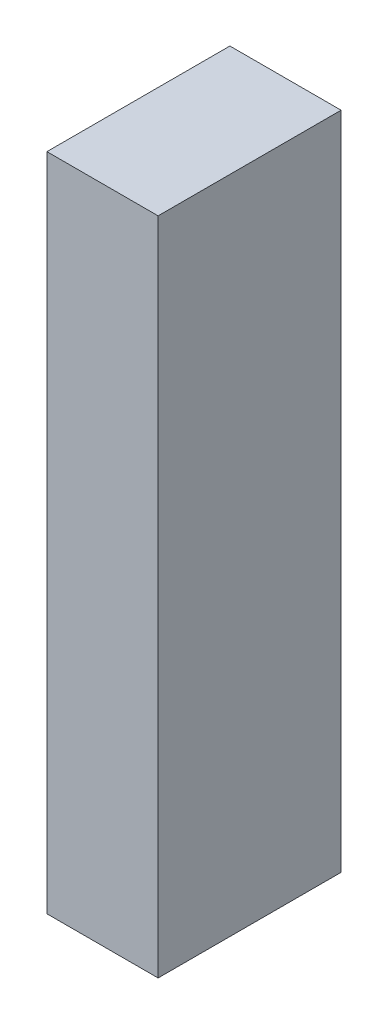
ISO-10303-21;
HEADER;
FILE_DESCRIPTION(('STEP AP214'),'2;1');
FILE_NAME('part.step','',(''),(''),'','','');
FILE_SCHEMA(('AUTOMOTIVE_DESIGN { 1 0 10303 214 1 1 1 1 }'));
ENDSEC;
DATA;
#1=APPLICATION_CONTEXT('core data for automotive mechanical design processes');
#2=APPLICATION_PROTOCOL_DEFINITION('international standard','automotive_design',2000,#1);
#3=PRODUCT_CONTEXT('',#1,'mechanical');
#4=PRODUCT('Part','Part','',(#3));
#5=PRODUCT_RELATED_PRODUCT_CATEGORY('part','',(#4));
#6=PRODUCT_DEFINITION_FORMATION('','',#4);
#7=PRODUCT_DEFINITION_CONTEXT('part definition',#1,'design');
#8=PRODUCT_DEFINITION('design','',#6,#7);
#9=PRODUCT_DEFINITION_SHAPE('','',#8);
#10=(LENGTH_UNIT() NAMED_UNIT(*) SI_UNIT(.MILLI.,.METRE.));
#11=(NAMED_UNIT(*) PLANE_ANGLE_UNIT() SI_UNIT($,.RADIAN.));
#12=(NAMED_UNIT(*) SI_UNIT($,.STERADIAN.) SOLID_ANGLE_UNIT());
#13=UNCERTAINTY_MEASURE_WITH_UNIT(LENGTH_MEASURE(1.E-05),#10,'distance_accuracy_value','');
#14=(GEOMETRIC_REPRESENTATION_CONTEXT(3) GLOBAL_UNCERTAINTY_ASSIGNED_CONTEXT((#13)) GLOBAL_UNIT_ASSIGNED_CONTEXT((#10,
#11,#12)) REPRESENTATION_CONTEXT('',''));
#15=CARTESIAN_POINT('',(0.,0.,0.));
#16=DIRECTION('',(0.,0.,1.));
#17=DIRECTION('',(1.,0.,0.));
#18=AXIS2_PLACEMENT_3D('',#15,#16,#17);
#19=CARTESIAN_POINT('',(-6.53611364796,-7.867641210324,0.));
#20=DIRECTION('',(1.,0.,0.));
#21=DIRECTION('',(0.,1.,0.));
#22=AXIS2_PLACEMENT_3D('',#19,#20,#21);
#23=PLANE('',#22);
#24=DIRECTION('',(0.,-1.,0.));
#25=VECTOR('',#24,1.);
#26=CARTESIAN_POINT('',(-6.53611364796,-7.506899475119,0.));
#27=LINE('',#26,#25);
#28=CARTESIAN_POINT('',(-6.53611364796,-7.506899475119,0.));
#29=VERTEX_POINT('',#28);
#30=CARTESIAN_POINT('',(-6.53611364796,-7.867641210324,0.));
#31=VERTEX_POINT('',#30);
#32=EDGE_CURVE('E11',#29,#31,#27,.T.);
#33=ORIENTED_EDGE('',*,*,#32,.F.);
#34=DIRECTION('',(0.,0.,1.));
#35=VECTOR('',#34,1.);
#36=CARTESIAN_POINT('',(-6.53611364796,-7.506899475119,0.));
#37=LINE('',#36,#35);
#38=CARTESIAN_POINT('',(-6.53611364796,-7.506899475119,0.1));
#39=VERTEX_POINT('',#38);
#40=EDGE_CURVE('E24',#29,#39,#37,.T.);
#41=ORIENTED_EDGE('',*,*,#40,.T.);
#42=DIRECTION('',(0.,1.,0.));
#43=VECTOR('',#42,1.);
#44=CARTESIAN_POINT('',(-6.53611364796,-7.506899475119,0.1));
#45=LINE('',#44,#43);
#46=CARTESIAN_POINT('',(-6.53611364796,-7.867641210324,0.1));
#47=VERTEX_POINT('',#46);
#48=EDGE_CURVE('E75',#47,#39,#45,.T.);
#49=ORIENTED_EDGE('',*,*,#48,.F.);
#50=DIRECTION('',(0.,0.,1.));
#51=VECTOR('',#50,1.);
#52=CARTESIAN_POINT('',(-6.53611364796,-7.867641210324,0.));
#53=LINE('',#52,#51);
#54=EDGE_CURVE('E85',#31,#47,#53,.T.);
#55=ORIENTED_EDGE('',*,*,#54,.F.);
#56=EDGE_LOOP('',(#33,#41,#49,#55));
#57=FACE_BOUND('',#56,.T.);
#58=ADVANCED_FACE('F17',(#57),#23,.T.);
#59=CARTESIAN_POINT('',(-6.596886553674,-7.867641210324,0.));
#60=DIRECTION('',(0.,-1.,0.));
#61=DIRECTION('',(1.,0.,0.));
#62=AXIS2_PLACEMENT_3D('',#59,#60,#61);
#63=PLANE('',#62);
#64=DIRECTION('',(-1.,0.,0.));
#65=VECTOR('',#64,1.);
#66=CARTESIAN_POINT('',(-6.53611364796,-7.867641210324,0.));
#67=LINE('',#66,#65);
#68=CARTESIAN_POINT('',(-6.596886553674,-7.867641210324,0.));
#69=VERTEX_POINT('',#68);
#70=EDGE_CURVE('E83',#31,#69,#67,.T.);
#71=ORIENTED_EDGE('',*,*,#70,.F.);
#72=ORIENTED_EDGE('',*,*,#54,.T.);
#73=DIRECTION('',(1.,0.,0.));
#74=VECTOR('',#73,1.);
#75=CARTESIAN_POINT('',(-6.53611364796,-7.867641210324,0.1));
#76=LINE('',#75,#74);
#77=CARTESIAN_POINT('',(-6.596886553674,-7.867641210324,0.1));
#78=VERTEX_POINT('',#77);
#79=EDGE_CURVE('E81',#78,#47,#76,.T.);
#80=ORIENTED_EDGE('',*,*,#79,.F.);
#81=DIRECTION('',(0.,0.,1.));
#82=VECTOR('',#81,1.);
#83=CARTESIAN_POINT('',(-6.596886553674,-7.867641210324,0.));
#84=LINE('',#83,#82);
#85=EDGE_CURVE('E61',#69,#78,#84,.T.);
#86=ORIENTED_EDGE('',*,*,#85,.F.);
#87=EDGE_LOOP('',(#71,#72,#80,#86));
#88=FACE_BOUND('',#87,.T.);
#89=ADVANCED_FACE('F91',(#88),#63,.T.);
#90=CARTESIAN_POINT('',(-6.596886553674,-7.506899475119,0.));
#91=DIRECTION('',(-1.,0.,0.));
#92=DIRECTION('',(0.,-1.,0.));
#93=AXIS2_PLACEMENT_3D('',#90,#91,#92);
#94=PLANE('',#93);
#95=DIRECTION('',(0.,1.,0.));
#96=VECTOR('',#95,1.);
#97=CARTESIAN_POINT('',(-6.596886553674,-7.867641210324,0.));
#98=LINE('',#97,#96);
#99=CARTESIAN_POINT('',(-6.596886553674,-7.506899475119,0.));
#100=VERTEX_POINT('',#99);
#101=EDGE_CURVE('E65',#69,#100,#98,.T.);
#102=ORIENTED_EDGE('',*,*,#101,.F.);
#103=ORIENTED_EDGE('',*,*,#85,.T.);
#104=DIRECTION('',(0.,-1.,0.));
#105=VECTOR('',#104,1.);
#106=CARTESIAN_POINT('',(-6.596886553674,-7.867641210324,0.1));
#107=LINE('',#106,#105);
#108=CARTESIAN_POINT('',(-6.596886553674,-7.506899475119,0.1));
#109=VERTEX_POINT('',#108);
#110=EDGE_CURVE('E54',#109,#78,#107,.T.);
#111=ORIENTED_EDGE('',*,*,#110,.F.);
#112=DIRECTION('',(0.,0.,1.));
#113=VECTOR('',#112,1.);
#114=CARTESIAN_POINT('',(-6.596886553674,-7.506899475119,0.));
#115=LINE('',#114,#113);
#116=EDGE_CURVE('E58',#100,#109,#115,.T.);
#117=ORIENTED_EDGE('',*,*,#116,.F.);
#118=EDGE_LOOP('',(#102,#103,#111,#117));
#119=FACE_BOUND('',#118,.T.);
#120=ADVANCED_FACE('F57',(#119),#94,.T.);
#121=CARTESIAN_POINT('',(-6.53611364796,-7.506899475119,0.));
#122=DIRECTION('',(0.,1.,0.));
#123=DIRECTION('',(-1.,0.,0.));
#124=AXIS2_PLACEMENT_3D('',#121,#122,#123);
#125=PLANE('',#124);
#126=DIRECTION('',(1.,0.,0.));
#127=VECTOR('',#126,1.);
#128=CARTESIAN_POINT('',(-6.596886553674,-7.506899475119,0.));
#129=LINE('',#128,#127);
#130=EDGE_CURVE('E71',#100,#29,#129,.T.);
#131=ORIENTED_EDGE('',*,*,#130,.F.);
#132=ORIENTED_EDGE('',*,*,#116,.T.);
#133=DIRECTION('',(-1.,0.,0.));
#134=VECTOR('',#133,1.);
#135=CARTESIAN_POINT('',(-6.596886553674,-7.506899475119,0.1));
#136=LINE('',#135,#134);
#137=EDGE_CURVE('E70',#39,#109,#136,.T.);
#138=ORIENTED_EDGE('',*,*,#137,.F.);
#139=ORIENTED_EDGE('',*,*,#40,.F.);
#140=EDGE_LOOP('',(#131,#132,#138,#139));
#141=FACE_BOUND('',#140,.T.);
#142=ADVANCED_FACE('F69',(#141),#125,.T.);
#143=CARTESIAN_POINT('',(-6.566500100817,-7.687270342722,0.));
#144=DIRECTION('',(0.,0.,1.));
#145=DIRECTION('',(1.,0.,0.));
#146=AXIS2_PLACEMENT_3D('',#143,#144,#145);
#147=PLANE('',#146);
#148=ORIENTED_EDGE('',*,*,#130,.T.);
#149=ORIENTED_EDGE('',*,*,#32,.T.);
#150=ORIENTED_EDGE('',*,*,#70,.T.);
#151=ORIENTED_EDGE('',*,*,#101,.T.);
#152=EDGE_LOOP('',(#148,#149,#150,#151));
#153=FACE_BOUND('',#152,.T.);
#154=ADVANCED_FACE('F88',(#153),#147,.F.);
#155=CARTESIAN_POINT('',(-6.566500100817,-7.687270342722,0.1));
#156=DIRECTION('',(0.,0.,1.));
#157=DIRECTION('',(1.,0.,0.));
#158=AXIS2_PLACEMENT_3D('',#155,#156,#157);
#159=PLANE('',#158);
#160=ORIENTED_EDGE('',*,*,#137,.T.);
#161=ORIENTED_EDGE('',*,*,#110,.T.);
#162=ORIENTED_EDGE('',*,*,#79,.T.);
#163=ORIENTED_EDGE('',*,*,#48,.T.);
#164=EDGE_LOOP('',(#160,#161,#162,#163));
#165=FACE_BOUND('',#164,.T.);
#166=ADVANCED_FACE('F74',(#165),#159,.T.);
#167=CLOSED_SHELL('',(#58,#89,#120,#142,#154,#166));
#168=MANIFOLD_SOLID_BREP('B1',#167);
#169=ADVANCED_BREP_SHAPE_REPRESENTATION('',(#18,#168),#14);
#170=SHAPE_DEFINITION_REPRESENTATION(#9,#169);
ENDSEC;
END-ISO-10303-21;
